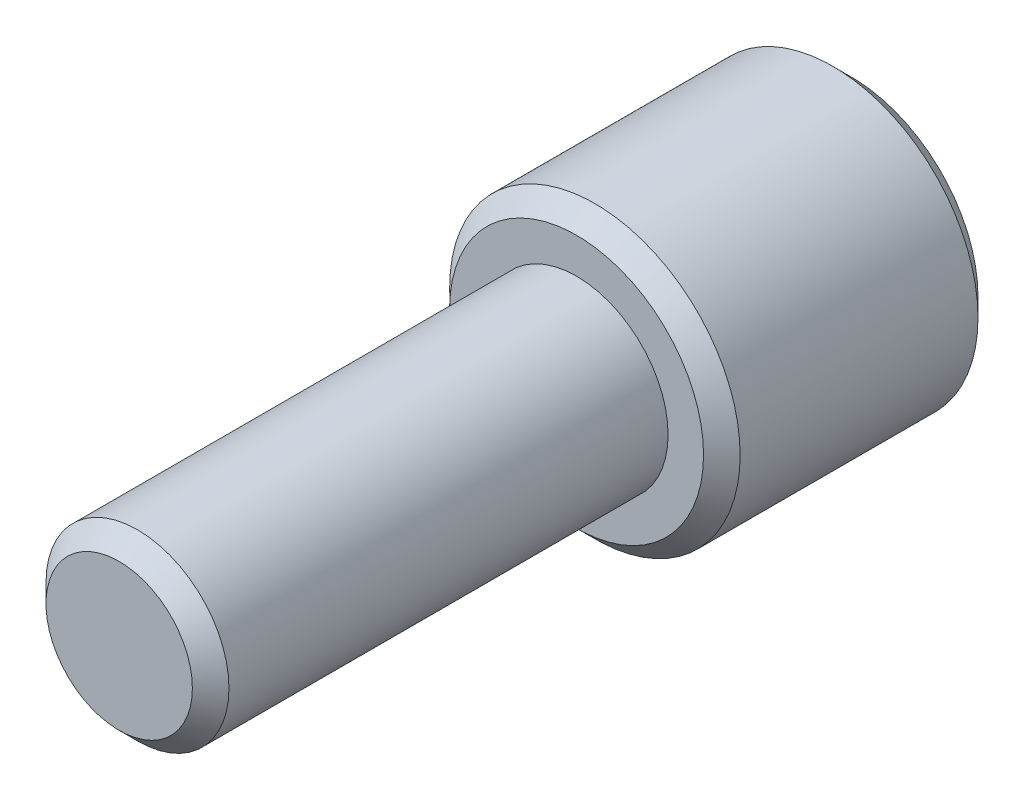
ISO-10303-21;
HEADER;
FILE_DESCRIPTION(('STEP AP214'),'2;1');
FILE_NAME('part.step','',(''),(''),'','','');
FILE_SCHEMA(('AUTOMOTIVE_DESIGN { 1 0 10303 214 1 1 1 1 }'));
ENDSEC;
DATA;
#1=APPLICATION_CONTEXT('core data for automotive mechanical design processes');
#2=APPLICATION_PROTOCOL_DEFINITION('international standard','automotive_design',2000,#1);
#3=PRODUCT_CONTEXT('',#1,'mechanical');
#4=PRODUCT('Part','Part','',(#3));
#5=PRODUCT_RELATED_PRODUCT_CATEGORY('part','',(#4));
#6=PRODUCT_DEFINITION_FORMATION('','',#4);
#7=PRODUCT_DEFINITION_CONTEXT('part definition',#1,'design');
#8=PRODUCT_DEFINITION('design','',#6,#7);
#9=PRODUCT_DEFINITION_SHAPE('','',#8);
#10=(LENGTH_UNIT() NAMED_UNIT(*) SI_UNIT(.MILLI.,.METRE.));
#11=(NAMED_UNIT(*) PLANE_ANGLE_UNIT() SI_UNIT($,.RADIAN.));
#12=(NAMED_UNIT(*) SI_UNIT($,.STERADIAN.) SOLID_ANGLE_UNIT());
#13=UNCERTAINTY_MEASURE_WITH_UNIT(LENGTH_MEASURE(1.E-05),#10,'distance_accuracy_value','');
#14=(GEOMETRIC_REPRESENTATION_CONTEXT(3) GLOBAL_UNCERTAINTY_ASSIGNED_CONTEXT((#13)) GLOBAL_UNIT_ASSIGNED_CONTEXT((#10,
#11,#12)) REPRESENTATION_CONTEXT('',''));
#15=CARTESIAN_POINT('',(0.,0.,0.));
#16=DIRECTION('',(0.,0.,1.));
#17=DIRECTION('',(1.,0.,0.));
#18=AXIS2_PLACEMENT_3D('',#15,#16,#17);
#19=CARTESIAN_POINT('',(0.,0.,12.));
#20=DIRECTION('',(0.,0.,1.));
#21=DIRECTION('',(1.,0.,0.));
#22=AXIS2_PLACEMENT_3D('',#19,#20,#21);
#23=PLANE('',#22);
#24=CARTESIAN_POINT('',(0.,0.,12.));
#25=DIRECTION('',(0.,0.,1.));
#26=DIRECTION('',(1.,0.,0.));
#27=AXIS2_PLACEMENT_3D('',#24,#25,#26);
#28=CIRCLE('',#27,5.54999999999999);
#29=CARTESIAN_POINT('',(5.54999999999999,0.,12.));
#30=VERTEX_POINT('',#29);
#31=EDGE_CURVE('E140',#30,#30,#28,.T.);
#32=ORIENTED_EDGE('',*,*,#31,.T.);
#33=EDGE_LOOP('',(#32));
#34=FACE_BOUND('',#33,.T.);
#35=CARTESIAN_POINT('',(0.,0.,12.));
#36=DIRECTION('',(0.,0.,1.));
#37=DIRECTION('',(1.,0.,0.));
#38=AXIS2_PLACEMENT_3D('',#35,#36,#37);
#39=CIRCLE('',#38,4.);
#40=CARTESIAN_POINT('',(4.,0.,12.));
#41=VERTEX_POINT('',#40);
#42=EDGE_CURVE('E56',#41,#41,#39,.T.);
#43=ORIENTED_EDGE('',*,*,#42,.F.);
#44=EDGE_LOOP('',(#43));
#45=FACE_BOUND('',#44,.T.);
#46=ADVANCED_FACE('F33',(#34,#45),#23,.T.);
#47=CARTESIAN_POINT('',(0.,0.,12.));
#48=DIRECTION('',(0.,0.,-1.));
#49=DIRECTION('',(-1.,0.,0.));
#50=AXIS2_PLACEMENT_3D('',#47,#48,#49);
#51=CYLINDRICAL_SURFACE('',#50,6.35);
#52=CARTESIAN_POINT('',(0.,0.,11.2));
#53=DIRECTION('',(0.,0.,1.));
#54=DIRECTION('',(1.,0.,0.));
#55=AXIS2_PLACEMENT_3D('',#52,#53,#54);
#56=CIRCLE('',#55,6.35);
#57=CARTESIAN_POINT('',(6.35,0.,11.2));
#58=VERTEX_POINT('',#57);
#59=EDGE_CURVE('E41',#58,#58,#56,.F.);
#60=ORIENTED_EDGE('',*,*,#59,.T.);
#61=EDGE_LOOP('',(#60));
#62=FACE_BOUND('',#61,.T.);
#63=CARTESIAN_POINT('',(0.,0.,0.800000000000002));
#64=DIRECTION('',(0.,0.,1.));
#65=DIRECTION('',(1.,0.,0.));
#66=AXIS2_PLACEMENT_3D('',#63,#64,#65);
#67=CIRCLE('',#66,6.35);
#68=CARTESIAN_POINT('',(6.35,0.,0.800000000000002));
#69=VERTEX_POINT('',#68);
#70=EDGE_CURVE('E144',#69,#69,#67,.T.);
#71=ORIENTED_EDGE('',*,*,#70,.T.);
#72=EDGE_LOOP('',(#71));
#73=FACE_BOUND('',#72,.T.);
#74=CARTESIAN_POINT('',(0.,-6.35,8.));
#75=CARTESIAN_POINT('',(0.109459382542907,-6.34999954177388,7.99999941645051));
#76=CARTESIAN_POINT('',(0.218925049959982,-6.34714311321166,7.99098441289842));
#77=CARTESIAN_POINT('',(0.434652473788955,-6.33602827356407,7.9552589175087));
#78=CARTESIAN_POINT('',(0.540913545874182,-6.32776871709148,7.92854467366542));
#79=CARTESIAN_POINT('',(0.747089875657803,-6.30674936557198,7.85841283927101));
#80=CARTESIAN_POINT('',(0.847014764673543,-6.2939966038065,7.8150213442808));
#81=CARTESIAN_POINT('',(1.03817017833074,-6.26530583445687,7.712878559723));
#82=CARTESIAN_POINT('',(1.12939928812193,-6.24936730983397,7.65412477642937));
#83=CARTESIAN_POINT('',(1.30343118018697,-6.21543683798116,7.52098863879435));
#84=CARTESIAN_POINT('',(1.38592345094522,-6.19739963027479,7.44621197364388));
#85=CARTESIAN_POINT('',(1.53742831833673,-6.16156531174633,7.28399212756702));
#86=CARTESIAN_POINT('',(1.60643835501439,-6.14376824711775,7.19654654659375));
#87=CARTESIAN_POINT('',(1.73071363408787,-6.10994220236164,7.00877070623833));
#88=CARTESIAN_POINT('',(1.78558916761594,-6.09396900491067,6.90817152277175));
#89=CARTESIAN_POINT('',(1.87751386092633,-6.06628083683232,6.69858801339595));
#90=CARTESIAN_POINT('',(1.91456780104787,-6.05456472452069,6.58960594516073));
#91=CARTESIAN_POINT('',(1.96865797245166,-6.03719105635797,6.36985743245523));
#92=CARTESIAN_POINT('',(1.98627089440143,-6.03135942687504,6.25924708658491));
#93=CARTESIAN_POINT('',(2.00278087222624,-6.02589838737814,6.03649943839799));
#94=CARTESIAN_POINT('',(2.00168299423813,-6.02626729850521,5.9243625576223));
#95=CARTESIAN_POINT('',(1.98125320609646,-6.03301213155008,5.70653203745703));
#96=CARTESIAN_POINT('',(1.96265658538293,-6.03914580837347,5.60076066873881));
#97=CARTESIAN_POINT('',(1.90895021373769,-6.05633519979143,5.39392306571445));
#98=CARTESIAN_POINT('',(1.8738386824976,-6.06739144503234,5.2928573399681));
#99=CARTESIAN_POINT('',(1.78758434079555,-6.0933643515369,5.09655766918764));
#100=CARTESIAN_POINT('',(1.73621215869284,-6.10833567795451,5.00143205398725));
#101=CARTESIAN_POINT('',(1.6190540664784,-6.14042705773518,4.82091127849859));
#102=CARTESIAN_POINT('',(1.55326436261562,-6.15754767614423,4.73551868831451));
#103=CARTESIAN_POINT('',(1.40553948054554,-6.19297824394465,4.57273387677394));
#104=CARTESIAN_POINT('',(1.32299795804768,-6.2113065642987,4.4958948770763));
#105=CARTESIAN_POINT('',(1.14597287727256,-6.24638917019528,4.35701392399215));
#106=CARTESIAN_POINT('',(1.05148840693985,-6.26314333535266,4.29497310175418));
#107=CARTESIAN_POINT('',(0.852181054275978,-6.29337063173253,4.18706679062044));
#108=CARTESIAN_POINT('',(0.747281283701516,-6.30681635072294,4.14133511854089));
#109=CARTESIAN_POINT('',(0.53075539857108,-6.32871380255594,4.06833214610388));
#110=CARTESIAN_POINT('',(0.419131371671138,-6.33716707666898,4.0410551480299));
#111=CARTESIAN_POINT('',(0.197020017835357,-6.34787832908592,4.00668253217873));
#112=CARTESIAN_POINT('',(0.0866594761204072,-6.35036604099747,3.9988381508384));
#113=CARTESIAN_POINT('',(-0.133813926362037,-6.34954641773507,4.00143980144652));
#114=CARTESIAN_POINT('',(-0.243926821510502,-6.34623994398884,4.01188311454394));
#115=CARTESIAN_POINT('',(-0.45787863778879,-6.33435451969435,4.05016353853882));
#116=CARTESIAN_POINT('',(-0.561805824109793,-6.325911202165,4.07755349672888));
#117=CARTESIAN_POINT('',(-0.763559126456237,-6.30474229444981,4.14840255163337));
#118=CARTESIAN_POINT('',(-0.86138448373332,-6.29201617296049,4.19186364211909));
#119=CARTESIAN_POINT('',(-1.05083641206033,-6.26319856305455,4.29481624770412));
#120=CARTESIAN_POINT('',(-1.14225110153446,-6.24703194034033,4.35467605180154));
#121=CARTESIAN_POINT('',(-1.31398832981217,-6.21318025142311,4.48828611830548));
#122=CARTESIAN_POINT('',(-1.394307804701,-6.19549476796846,4.56204020434403));
#123=CARTESIAN_POINT('',(-1.54493496266177,-6.15970098041184,4.72486730316873));
#124=CARTESIAN_POINT('',(-1.61470885314466,-6.1416043516294,4.81443781225088));
#125=CARTESIAN_POINT('',(-1.73828550034023,-6.10778048462924,5.00440908318169));
#126=CARTESIAN_POINT('',(-1.79208847266323,-6.09205321442616,5.10480969879696));
#127=CARTESIAN_POINT('',(-1.88186972548412,-6.06492137157673,5.31340922433402));
#128=CARTESIAN_POINT('',(-1.91791378151849,-6.05350088491069,5.42157763111646));
#129=CARTESIAN_POINT('',(-1.97114343438127,-6.03638058511952,5.64288296304508));
#130=CARTESIAN_POINT('',(-1.98833635449891,-6.03067855056365,5.75601794100063));
#131=CARTESIAN_POINT('',(-2.00284439370545,-6.02587471885277,5.97845754983298));
#132=CARTESIAN_POINT('',(-2.00103634345504,-6.02648176413455,6.08769940250111));
#133=CARTESIAN_POINT('',(-1.97971522185172,-6.03351893966243,6.30424061257888));
#134=CARTESIAN_POINT('',(-1.96020300106662,-6.03994879016139,6.41154006305545));
#135=CARTESIAN_POINT('',(-1.90461841343822,-6.05770205715241,6.61955543972629));
#136=CARTESIAN_POINT('',(-1.86880073990097,-6.06895005951139,6.72034634805821));
#137=CARTESIAN_POINT('',(-1.78182311987174,-6.0950519726527,6.91456815637816));
#138=CARTESIAN_POINT('',(-1.7306600173762,-6.10990662507357,7.00799753736861));
#139=CARTESIAN_POINT('',(-1.61207166769779,-6.14228296482453,7.18885533551896));
#140=CARTESIAN_POINT('',(-1.54408200610561,-6.15988705347009,7.275898871557));
#141=CARTESIAN_POINT('',(-1.39475914789555,-6.19540382399595,7.43762516074985));
#142=CARTESIAN_POINT('',(-1.31342235965995,-6.21331658777418,7.51230457591052));
#143=CARTESIAN_POINT('',(-1.13645022907771,-6.24814930497826,7.64967858918255));
#144=CARTESIAN_POINT('',(-1.04042842012035,-6.26501620684602,7.71189029117953));
#145=CARTESIAN_POINT('',(-0.838759092324702,-6.29518499838427,7.8192078809382));
#146=CARTESIAN_POINT('',(-0.733115228456041,-6.30848823421976,7.86432023061282));
#147=CARTESIAN_POINT('',(-0.523924084589957,-6.32915110555605,7.93303881102666));
#148=CARTESIAN_POINT('',(-0.420884380962412,-6.33690087757196,7.95807602276617));
#149=CARTESIAN_POINT('',(-0.211898004201454,-6.34732501355995,7.99155515687942));
#150=CARTESIAN_POINT('',(-0.105951946376475,-6.35000044354306,8.00000056485066));
#151=CARTESIAN_POINT('',(0.,-6.35,8.));
#152=B_SPLINE_CURVE_WITH_KNOTS('',3,(#74,#75,#76,#77,#78,#79,#80,#81,#82,#83,#84,#85,#86,#87,
#88,#89,#90,#91,#92,#93,#94,#95,#96,#97,#98,#99,#100,#101,#102,#103,#104,#105,#106,#107,#108,
#109,#110,#111,#112,#113,#114,#115,#116,#117,#118,#119,#120,#121,#122,#123,#124,#125,#126,#127,
#128,#129,#130,#131,#132,#133,#134,#135,#136,#137,#138,#139,#140,#141,#142,#143,#144,#145,#146,
#147,#148,#149,#150,#151),.UNSPECIFIED.,.T.,.F.,(4,2,2,2,2,2,2,2,2,2,2,2,2,2,2,2,2,2,2,2,2,2,2,
2,2,2,2,2,2,2,2,2,2,2,2,2,2,2,4),(0.,0.327988650558007,0.656046852642941,0.983593805173075,
1.31119396071542,1.6480406473964,1.98495123122211,2.33034249119075,2.67564105409013,
3.01039595432063,3.34506021774285,3.66626171481525,3.98749784536771,4.31348397544876,
4.63955598702786,4.98071999436009,5.3219100713613,5.66583848283943,6.00966066096294,
6.34001323425943,6.67031669785622,6.99225602053112,7.31423529613717,7.64414085870835,
7.97413734250023,8.31743010871831,8.66071824020989,9.00272515843012,9.34459916667783,
9.6707687934964,9.99692275086076,10.3181482438305,10.6394398466999,10.9734721104888,
11.3075944078494,11.6528624869261,11.9979999574323,12.3155454971876,12.6330243200048),.UNSPECIFIED.);
#153=CARTESIAN_POINT('',(0.,-6.35,8.));
#154=VERTEX_POINT('',#153);
#155=EDGE_CURVE('E62',#154,#154,#152,.T.);
#156=ORIENTED_EDGE('',*,*,#155,.T.);
#157=EDGE_LOOP('',(#156));
#158=FACE_BOUND('',#157,.T.);
#159=CARTESIAN_POINT('',(-6.35,0.,4.));
#160=CARTESIAN_POINT('',(-6.34999954177388,0.109459382542907,4.00000058354949));
#161=CARTESIAN_POINT('',(-6.34714311321166,0.218925049959982,4.00901558710158));
#162=CARTESIAN_POINT('',(-6.33602827356407,0.434652473788955,4.0447410824913));
#163=CARTESIAN_POINT('',(-6.32776871709148,0.540913545874182,4.07145532633459));
#164=CARTESIAN_POINT('',(-6.30674936557198,0.747089875657803,4.14158716072899));
#165=CARTESIAN_POINT('',(-6.2939966038065,0.847014764673544,4.1849786557192));
#166=CARTESIAN_POINT('',(-6.26530583445687,1.03817017833074,4.287121440277));
#167=CARTESIAN_POINT('',(-6.24936730983396,1.12939928812193,4.34587522357063));
#168=CARTESIAN_POINT('',(-6.21543683798116,1.30343118018697,4.47901136120565));
#169=CARTESIAN_POINT('',(-6.19739963027479,1.38592345094522,4.55378802635612));
#170=CARTESIAN_POINT('',(-6.16156531174633,1.53742831833673,4.71600787243298));
#171=CARTESIAN_POINT('',(-6.14376824711775,1.60643835501439,4.80345345340625));
#172=CARTESIAN_POINT('',(-6.10994220236164,1.73071363408787,4.99122929376167));
#173=CARTESIAN_POINT('',(-6.09396900491067,1.78558916761594,5.09182847722825));
#174=CARTESIAN_POINT('',(-6.06628083683232,1.87751386092633,5.30141198660405));
#175=CARTESIAN_POINT('',(-6.05456472452069,1.91456780104787,5.41039405483927));
#176=CARTESIAN_POINT('',(-6.03719105635797,1.96865797245166,5.63014256754477));
#177=CARTESIAN_POINT('',(-6.03135942687504,1.98627089440143,5.74075291341509));
#178=CARTESIAN_POINT('',(-6.02589838737814,2.00278087222624,5.96350056160201));
#179=CARTESIAN_POINT('',(-6.02626729850521,2.00168299423813,6.0756374423777));
#180=CARTESIAN_POINT('',(-6.03301213155008,1.98125320609646,6.29346796254297));
#181=CARTESIAN_POINT('',(-6.03914580837347,1.96265658538293,6.39923933126119));
#182=CARTESIAN_POINT('',(-6.05633519979143,1.90895021373769,6.60607693428555));
#183=CARTESIAN_POINT('',(-6.06739144503234,1.8738386824976,6.7071426600319));
#184=CARTESIAN_POINT('',(-6.0933643515369,1.78758434079555,6.90344233081236));
#185=CARTESIAN_POINT('',(-6.10833567795451,1.73621215869284,6.99856794601275));
#186=CARTESIAN_POINT('',(-6.14042705773518,1.6190540664784,7.17908872150141));
#187=CARTESIAN_POINT('',(-6.15754767614423,1.55326436261562,7.26448131168549));
#188=CARTESIAN_POINT('',(-6.19297824394465,1.40553948054554,7.42726612322606));
#189=CARTESIAN_POINT('',(-6.2113065642987,1.32299795804768,7.5041051229237));
#190=CARTESIAN_POINT('',(-6.24638917019528,1.14597287727256,7.64298607600785));
#191=CARTESIAN_POINT('',(-6.26314333535266,1.05148840693984,7.70502689824583));
#192=CARTESIAN_POINT('',(-6.29337063173254,0.852181054275976,7.81293320937956));
#193=CARTESIAN_POINT('',(-6.30681635072295,0.747281283701515,7.85866488145912));
#194=CARTESIAN_POINT('',(-6.32871380255594,0.530755398571079,7.93166785389612));
#195=CARTESIAN_POINT('',(-6.33716707666898,0.419131371671138,7.9589448519701));
#196=CARTESIAN_POINT('',(-6.34787832908592,0.197020017835356,7.99331746782127));
#197=CARTESIAN_POINT('',(-6.35036604099747,0.0866594761204061,8.0011618491616));
#198=CARTESIAN_POINT('',(-6.34954641773507,-0.133813926362039,7.99856019855348));
#199=CARTESIAN_POINT('',(-6.34623994398884,-0.243926821510504,7.98811688545606));
#200=CARTESIAN_POINT('',(-6.33435451969435,-0.457878637788792,7.94983646146118));
#201=CARTESIAN_POINT('',(-6.325911202165,-0.561805824109796,7.92244650327112));
#202=CARTESIAN_POINT('',(-6.30474229444981,-0.76355912645624,7.85159744836663));
#203=CARTESIAN_POINT('',(-6.29201617296049,-0.861384483733322,7.8081363578809));
#204=CARTESIAN_POINT('',(-6.26319856305455,-1.05083641206033,7.70518375229588));
#205=CARTESIAN_POINT('',(-6.24703194034033,-1.14225110153446,7.64532394819846));
#206=CARTESIAN_POINT('',(-6.21318025142311,-1.31398832981217,7.51171388169452));
#207=CARTESIAN_POINT('',(-6.19549476796846,-1.394307804701,7.43795979565597));
#208=CARTESIAN_POINT('',(-6.15970098041184,-1.54493496266177,7.27513269683127));
#209=CARTESIAN_POINT('',(-6.1416043516294,-1.61470885314467,7.18556218774911));
#210=CARTESIAN_POINT('',(-6.10778048462924,-1.73828550034023,6.99559091681831));
#211=CARTESIAN_POINT('',(-6.09205321442616,-1.79208847266324,6.89519030120304));
#212=CARTESIAN_POINT('',(-6.06492137157673,-1.88186972548412,6.68659077566598));
#213=CARTESIAN_POINT('',(-6.05350088491069,-1.91791378151849,6.57842236888353));
#214=CARTESIAN_POINT('',(-6.03638058511951,-1.97114343438128,6.35711703695491));
#215=CARTESIAN_POINT('',(-6.03067855056365,-1.98833635449891,6.24398205899937));
#216=CARTESIAN_POINT('',(-6.02587471885277,-2.00284439370545,6.02154245016702));
#217=CARTESIAN_POINT('',(-6.02648176413455,-2.00103634345504,5.91230059749889));
#218=CARTESIAN_POINT('',(-6.03351893966243,-1.97971522185172,5.69575938742112));
#219=CARTESIAN_POINT('',(-6.03994879016139,-1.96020300106662,5.58845993694455));
#220=CARTESIAN_POINT('',(-6.05770205715241,-1.90461841343822,5.3804445602737));
#221=CARTESIAN_POINT('',(-6.06895005951139,-1.86880073990097,5.27965365194179));
#222=CARTESIAN_POINT('',(-6.0950519726527,-1.78182311987174,5.08543184362183));
#223=CARTESIAN_POINT('',(-6.10990662507357,-1.7306600173762,4.99200246263139));
#224=CARTESIAN_POINT('',(-6.14228296482453,-1.61207166769779,4.81114466448104));
#225=CARTESIAN_POINT('',(-6.15988705347009,-1.54408200610561,4.724101128443));
#226=CARTESIAN_POINT('',(-6.19540382399595,-1.39475914789555,4.56237483925015));
#227=CARTESIAN_POINT('',(-6.21331658777418,-1.31342235965995,4.48769542408948));
#228=CARTESIAN_POINT('',(-6.24814930497826,-1.1364502290777,4.35032141081745));
#229=CARTESIAN_POINT('',(-6.26501620684602,-1.04042842012034,4.28810970882047));
#230=CARTESIAN_POINT('',(-6.29518499838427,-0.838759092324699,4.1807921190618));
#231=CARTESIAN_POINT('',(-6.30848823421976,-0.733115228456038,4.13567976938717));
#232=CARTESIAN_POINT('',(-6.32915110555605,-0.523924084589954,4.06696118897334));
#233=CARTESIAN_POINT('',(-6.33690087757196,-0.42088438096241,4.04192397723383));
#234=CARTESIAN_POINT('',(-6.34732501355995,-0.211898004201453,4.00844484312058));
#235=CARTESIAN_POINT('',(-6.35000044354306,-0.105951946376475,3.99999943514934));
#236=CARTESIAN_POINT('',(-6.35,0.,4.));
#237=B_SPLINE_CURVE_WITH_KNOTS('',3,(#159,#160,#161,#162,#163,#164,#165,#166,#167,#168,#169,
#170,#171,#172,#173,#174,#175,#176,#177,#178,#179,#180,#181,#182,#183,#184,#185,#186,#187,#188,
#189,#190,#191,#192,#193,#194,#195,#196,#197,#198,#199,#200,#201,#202,#203,#204,#205,#206,#207,
#208,#209,#210,#211,#212,#213,#214,#215,#216,#217,#218,#219,#220,#221,#222,#223,#224,#225,#226,
#227,#228,#229,#230,#231,#232,#233,#234,#235,#236),.UNSPECIFIED.,.T.,.F.,(4,2,2,2,2,2,2,2,2,2,2,
2,2,2,2,2,2,2,2,2,2,2,2,2,2,2,2,2,2,2,2,2,2,2,2,2,2,2,4),(0.,0.327988650558007,
0.656046852642941,0.983593805173076,1.31119396071542,1.6480406473964,1.98495123122211,
2.33034249119075,2.67564105409013,3.01039595432063,3.34506021774285,3.66626171481526,
3.98749784536771,4.31348397544876,4.63955598702786,4.9807199943601,5.32191007136131,
5.66583848283943,6.00966066096294,6.34001323425943,6.67031669785623,6.99225602053112,
7.31423529613717,7.64414085870835,7.97413734250024,8.31743010871831,8.6607182402099,
9.00272515843012,9.34459916667784,9.67076879349641,9.99692275086076,10.3181482438305,
10.6394398466999,10.9734721104888,11.3075944078494,11.6528624869261,11.9979999574323,
12.3155454971876,12.6330243200048),.UNSPECIFIED.);
#238=CARTESIAN_POINT('',(-6.35,0.,4.));
#239=VERTEX_POINT('',#238);
#240=EDGE_CURVE('E66',#239,#239,#237,.T.);
#241=ORIENTED_EDGE('',*,*,#240,.T.);
#242=EDGE_LOOP('',(#241));
#243=FACE_BOUND('',#242,.T.);
#244=ADVANCED_FACE('F96',(#62,#73,#158,#243),#51,.T.);
#245=CARTESIAN_POINT('',(0.,0.,0.));
#246=DIRECTION('',(0.,0.,1.));
#247=DIRECTION('',(1.,0.,0.));
#248=AXIS2_PLACEMENT_3D('',#245,#246,#247);
#249=PLANE('',#248);
#250=CARTESIAN_POINT('',(0.,0.,0.));
#251=DIRECTION('',(0.,0.,1.));
#252=DIRECTION('',(1.,0.,0.));
#253=AXIS2_PLACEMENT_3D('',#250,#251,#252);
#254=CIRCLE('',#253,5.55);
#255=CARTESIAN_POINT('',(5.55,0.,0.));
#256=VERTEX_POINT('',#255);
#257=EDGE_CURVE('E11',#256,#256,#254,.F.);
#258=ORIENTED_EDGE('',*,*,#257,.T.);
#259=EDGE_LOOP('',(#258));
#260=FACE_BOUND('',#259,.T.);
#261=CARTESIAN_POINT('',(0.,0.,0.));
#262=DIRECTION('',(0.,0.,-1.));
#263=DIRECTION('',(-1.,0.,0.));
#264=AXIS2_PLACEMENT_3D('',#261,#262,#263);
#265=CIRCLE('',#264,2.5);
#266=CARTESIAN_POINT('',(-2.5,0.,0.));
#267=VERTEX_POINT('',#266);
#268=EDGE_CURVE('E69',#267,#267,#265,.T.);
#269=ORIENTED_EDGE('',*,*,#268,.F.);
#270=EDGE_LOOP('',(#269));
#271=FACE_BOUND('',#270,.T.);
#272=ADVANCED_FACE('F101',(#260,#271),#249,.F.);
#273=CARTESIAN_POINT('',(0.,0.,32.));
#274=DIRECTION('',(0.,0.,-1.));
#275=DIRECTION('',(-1.,0.,0.));
#276=AXIS2_PLACEMENT_3D('',#273,#274,#275);
#277=CYLINDRICAL_SURFACE('',#276,4.);
#278=CARTESIAN_POINT('',(0.,0.,31.2));
#279=DIRECTION('',(0.,0.,1.));
#280=DIRECTION('',(1.,0.,0.));
#281=AXIS2_PLACEMENT_3D('',#278,#279,#280);
#282=CIRCLE('',#281,4.);
#283=CARTESIAN_POINT('',(4.,0.,31.2));
#284=VERTEX_POINT('',#283);
#285=EDGE_CURVE('E138',#284,#284,#282,.F.);
#286=ORIENTED_EDGE('',*,*,#285,.T.);
#287=EDGE_LOOP('',(#286));
#288=FACE_BOUND('',#287,.T.);
#289=ORIENTED_EDGE('',*,*,#42,.T.);
#290=EDGE_LOOP('',(#289));
#291=FACE_BOUND('',#290,.T.);
#292=ADVANCED_FACE('F125',(#288,#291),#277,.T.);
#293=CARTESIAN_POINT('',(0.,0.,32.));
#294=DIRECTION('',(0.,0.,1.));
#295=DIRECTION('',(1.,0.,0.));
#296=AXIS2_PLACEMENT_3D('',#293,#294,#295);
#297=PLANE('',#296);
#298=CARTESIAN_POINT('',(0.,0.,32.));
#299=DIRECTION('',(0.,0.,1.));
#300=DIRECTION('',(1.,0.,0.));
#301=AXIS2_PLACEMENT_3D('',#298,#299,#300);
#302=CIRCLE('',#301,3.2);
#303=CARTESIAN_POINT('',(3.2,0.,32.));
#304=VERTEX_POINT('',#303);
#305=EDGE_CURVE('E55',#304,#304,#302,.T.);
#306=ORIENTED_EDGE('',*,*,#305,.T.);
#307=EDGE_LOOP('',(#306));
#308=FACE_BOUND('',#307,.T.);
#309=ADVANCED_FACE('F127',(#308),#297,.T.);
#310=CARTESIAN_POINT('',(0.,0.,10.));
#311=DIRECTION('',(0.,0.,-1.));
#312=DIRECTION('',(-1.,0.,0.));
#313=AXIS2_PLACEMENT_3D('',#310,#311,#312);
#314=CYLINDRICAL_SURFACE('',#313,2.5);
#315=CARTESIAN_POINT('',(-2.5,0.,8.));
#316=CARTESIAN_POINT('',(-2.49999264947401,0.0959968964388692,7.99999242056707));
#317=CARTESIAN_POINT('',(-2.49441368411908,0.192133192964674,7.99303057133644));
#318=CARTESIAN_POINT('',(-2.47259269360604,0.381319365477407,7.96565005995827));
#319=CARTESIAN_POINT('',(-2.45632708000382,0.474361934321336,7.94520162873807));
#320=CARTESIAN_POINT('',(-2.4146672181517,0.654094916824507,7.89232172110493));
#321=CARTESIAN_POINT('',(-2.38933120144167,0.740821698128048,7.85996664856862));
#322=CARTESIAN_POINT('',(-2.33136010996601,0.906926323692543,7.78488265652265));
#323=CARTESIAN_POINT('',(-2.29872501207752,0.986304144671504,7.74215370414941));
#324=CARTESIAN_POINT('',(-2.21575664728952,1.16318123656703,7.63137163496894));
#325=CARTESIAN_POINT('',(-2.16321748603216,1.25736767952115,7.55968108482594));
#326=CARTESIAN_POINT('',(-2.05292192603027,1.43041367827883,7.4027219342605));
#327=CARTESIAN_POINT('',(-1.99515072200505,1.50922761533153,7.31741424649663));
#328=CARTESIAN_POINT('',(-1.87856001629835,1.6521591895554,7.13322601592733));
#329=CARTESIAN_POINT('',(-1.81973830902028,1.71602638457222,7.03415322702388));
#330=CARTESIAN_POINT('',(-1.7088210988299,1.82646834413604,6.82346121749581));
#331=CARTESIAN_POINT('',(-1.65670347089169,1.87310099386401,6.71188566611201));
#332=CARTESIAN_POINT('',(-1.58835652300928,1.93086043771819,6.52612104832302));
#333=CARTESIAN_POINT('',(-1.56628727770188,1.94865475820658,6.45618826201971));
#334=CARTESIAN_POINT('',(-1.53069889155832,1.97673396798331,6.31278731587953));
#335=CARTESIAN_POINT('',(-1.5171587417974,1.98703731881776,6.239328326475));
#336=CARTESIAN_POINT('',(-1.50084234061103,1.99939840142554,6.08980748112896));
#337=CARTESIAN_POINT('',(-1.49816096926556,2.00138345613423,6.01372851517921));
#338=CARTESIAN_POINT('',(-1.50439962302809,1.99669481699685,5.86229510796726));
#339=CARTESIAN_POINT('',(-1.51332946660241,1.99001379511087,5.7869413342337));
#340=CARTESIAN_POINT('',(-1.5432072129997,1.9669530271194,5.62777769738727));
#341=CARTESIAN_POINT('',(-1.56581842049528,1.94921808205621,5.544491993946));
#342=CARTESIAN_POINT('',(-1.61997459936279,1.90444547348848,5.38346444046297));
#343=CARTESIAN_POINT('',(-1.65154598198641,1.87738025642251,5.30573984346018));
#344=CARTESIAN_POINT('',(-1.73656116159416,1.79974102194077,5.11933789395902));
#345=CARTESIAN_POINT('',(-1.79313372968153,1.74414886595504,5.01419730169581));
#346=CARTESIAN_POINT('',(-1.90913780060687,1.61638467497537,4.81628332220067));
#347=CARTESIAN_POINT('',(-1.96857337048937,1.54418846902465,4.72352827915646));
#348=CARTESIAN_POINT('',(-2.08612751968448,1.38145818326396,4.54872522859493));
#349=CARTESIAN_POINT('',(-2.14416889260779,1.29048701026967,4.46702807769423));
#350=CARTESIAN_POINT('',(-2.25171871494994,1.09198491072667,4.31990050056569));
#351=CARTESIAN_POINT('',(-2.3012499182245,0.98449964520108,4.25442648388277));
#352=CARTESIAN_POINT('',(-2.37424585643318,0.78777781438056,4.1594371525901));
#353=CARTESIAN_POINT('',(-2.40111071224171,0.702177727329207,4.12499549556093));
#354=CARTESIAN_POINT('',(-2.44597564111417,0.524913923737154,4.06787354901203));
#355=CARTESIAN_POINT('',(-2.46398239496913,0.433254836272285,4.04518439505452));
#356=CARTESIAN_POINT('',(-2.48970335685206,0.245713233844928,4.01286145306421));
#357=CARTESIAN_POINT('',(-2.49736378633666,0.149811307212617,4.00329587525504));
#358=CARTESIAN_POINT('',(-2.50148682701864,-0.0426080028675175,3.99814095102371));
#359=CARTESIAN_POINT('',(-2.49795152409062,-0.139125268327962,4.00254900117794));
#360=CARTESIAN_POINT('',(-2.48076858642945,-0.321746674155462,4.02408281624768));
#361=CARTESIAN_POINT('',(-2.46796352405063,-0.408060891756566,4.04014917513901));
#362=CARTESIAN_POINT('',(-2.43417513213473,-0.576335674228721,4.08287218110156));
#363=CARTESIAN_POINT('',(-2.41318937553438,-0.65829493885694,4.10953197109662));
#364=CARTESIAN_POINT('',(-2.36289849431328,-0.821235877548909,4.17415037178393));
#365=CARTESIAN_POINT('',(-2.33315912736867,-0.901843619419054,4.21270578595636));
#366=CARTESIAN_POINT('',(-2.26783622722139,-1.05541000448331,4.29886215163279));
#367=CARTESIAN_POINT('',(-2.23225240258423,-1.12836826593788,4.34646355423455));
#368=CARTESIAN_POINT('',(-2.14993687522397,-1.27925237569143,4.45922431829687));
#369=CARTESIAN_POINT('',(-2.1023696976822,-1.35550718978129,4.526001690483));
#370=CARTESIAN_POINT('',(-2.00443497952019,-1.4965368759753,4.66938696137098));
#371=CARTESIAN_POINT('',(-1.95405970991097,-1.56127777727367,4.74602283683883));
#372=CARTESIAN_POINT('',(-1.87374135317135,-1.65568487930787,4.87643444323659));
#373=CARTESIAN_POINT('',(-1.84354743685463,-1.68913741792652,4.92736059075333));
#374=CARTESIAN_POINT('',(-1.78435415521131,-1.75155001920543,5.03262226142359));
#375=CARTESIAN_POINT('',(-1.75535542951891,-1.78050769868976,5.08695957188079));
#376=CARTESIAN_POINT('',(-1.69983828792997,-1.83358089959817,5.19887484028166));
#377=CARTESIAN_POINT('',(-1.67331090774834,-1.85771431687654,5.25643976724369));
#378=CARTESIAN_POINT('',(-1.62410209867689,-1.90088481958635,5.37500897850398));
#379=CARTESIAN_POINT('',(-1.60141789380427,-1.9199255893155,5.43601073751954));
#380=CARTESIAN_POINT('',(-1.5601942022258,-1.95360165889083,5.5660867242378));
#381=CARTESIAN_POINT('',(-1.54209716714775,-1.96779559724999,5.63542266494035));
#382=CARTESIAN_POINT('',(-1.5149337159379,-1.98878905619367,5.77683761273805));
#383=CARTESIAN_POINT('',(-1.50584452307524,-1.99560723074758,5.84890922045048));
#384=CARTESIAN_POINT('',(-1.49824736779721,-2.00132058716546,5.99434870546408));
#385=CARTESIAN_POINT('',(-1.49979625918437,-2.0001731977979,6.06772145415416));
#386=CARTESIAN_POINT('',(-1.51330771695992,-1.98996519544204,6.2129841930231));
#387=CARTESIAN_POINT('',(-1.52528679347386,-1.98089203653787,6.2848716473261));
#388=CARTESIAN_POINT('',(-1.56207076756083,-1.95207745752715,6.44460677434455));
#389=CARTESIAN_POINT('',(-1.5894925841937,-1.93009230408643,6.53142308249112));
#390=CARTESIAN_POINT('',(-1.65288907642407,-1.87608177217432,6.69863347868964));
#391=CARTESIAN_POINT('',(-1.68888887211293,-1.84402681542564,6.77900776003671));
#392=CARTESIAN_POINT('',(-1.75491158724438,-1.78094746311468,6.91217772204615));
#393=CARTESIAN_POINT('',(-1.78388907325007,-1.7520236319041,6.96651918151829));
#394=CARTESIAN_POINT('',(-1.84307948739002,-1.68964733782463,7.07183822981726));
#395=CARTESIAN_POINT('',(-1.87329286211508,-1.65619322765903,7.12281458495115));
#396=CARTESIAN_POINT('',(-1.96437997758119,-1.54918435570711,7.27077940329882));
#397=CARTESIAN_POINT('',(-2.02569808481402,-1.4689854164051,7.36279868666247));
#398=CARTESIAN_POINT('',(-2.14418278787112,-1.29001718858431,7.53338946483076));
#399=CARTESIAN_POINT('',(-2.201284919641,-1.19101966157649,7.61177022423679));
#400=CARTESIAN_POINT('',(-2.27874650804527,-1.02998399899547,7.71557672941679));
#401=CARTESIAN_POINT('',(-2.30318868109328,-0.9742554001997,7.74786844413512));
#402=CARTESIAN_POINT('',(-2.34866115465602,-0.858854828628049,7.80736810096138));
#403=CARTESIAN_POINT('',(-2.36969354228912,-0.799185299805368,7.83457915448451));
#404=CARTESIAN_POINT('',(-2.41420905511499,-0.655037739424251,7.89178005989561));
#405=CARTESIAN_POINT('',(-2.43602892887628,-0.569110239590122,7.91948267180093));
#406=CARTESIAN_POINT('',(-2.47058864976841,-0.392713097427724,7.9631576733877));
#407=CARTESIAN_POINT('',(-2.48335227816872,-0.302256024103141,7.9791607887746));
#408=CARTESIAN_POINT('',(-2.49405378309104,-0.175880930919915,7.9925630255603));
#409=CARTESIAN_POINT('',(-2.49627918763429,-0.140808552821275,7.99534737874577));
#410=CARTESIAN_POINT('',(-2.499253810179,-0.0704970748918292,7.99906746352746));
#411=CARTESIAN_POINT('',(-2.50000269971647,-0.0352579397117348,8.00000278378988));
#412=CARTESIAN_POINT('',(-2.5,0.,8.));
#413=B_SPLINE_CURVE_WITH_KNOTS('',3,(#315,#316,#317,#318,#319,#320,#321,#322,#323,#324,#325,
#326,#327,#328,#329,#330,#331,#332,#333,#334,#335,#336,#337,#338,#339,#340,#341,#342,#343,#344,
#345,#346,#347,#348,#349,#350,#351,#352,#353,#354,#355,#356,#357,#358,#359,#360,#361,#362,#363,
#364,#365,#366,#367,#368,#369,#370,#371,#372,#373,#374,#375,#376,#377,#378,#379,#380,#381,#382,
#383,#384,#385,#386,#387,#388,#389,#390,#391,#392,#393,#394,#395,#396,#397,#398,#399,#400,#401,
#402,#403,#404,#405,#406,#407,#408,#409,#410,#411,#412),.UNSPECIFIED.,.T.,.F.,(4,2,2,2,2,2,2,2,
2,2,2,2,2,2,2,2,2,2,2,2,2,2,2,2,2,2,2,2,2,2,2,2,2,2,2,2,2,2,2,2,2,2,2,2,2,2,2,2,4),(0.,
0.287836605992209,0.576310692639342,0.862965057250605,1.14962032997081,1.53607888200101,
1.92366738187851,2.31734741765481,2.70969292925127,2.9353448634113,3.1604387740811,
3.38749528500759,3.61474392028823,3.8775863003201,4.14121163495705,4.53425748188301,
4.92787915886674,5.33198173288419,5.73498644040676,6.02213978124802,6.30907621738868,
6.59749843639965,6.88586692268771,7.15087004938159,7.41595185759573,7.69742753051566,
7.9789172435135,8.31365537249325,8.64936529970902,8.85316560745906,9.05707360380851,
9.26021055202079,9.46320013996582,9.68152133432596,9.89928907450684,10.1182215471168,
10.3375012031536,10.616933053181,10.8971934831173,11.1010640012511,11.3050088506911,
11.7129165318148,12.1261363563906,12.3324811048119,12.5386990694968,12.8161540735935,
13.0928777702216,13.1985714874516,13.3042887145431),.UNSPECIFIED.);
#414=CARTESIAN_POINT('',(-1.76776695296637,-1.76776695296637,6.93541434669349));
#415=VERTEX_POINT('',#414);
#416=CARTESIAN_POINT('',(-1.76776695296637,-1.76776695296637,5.06458565330651));
#417=VERTEX_POINT('',#416);
#418=EDGE_CURVE('E61',#415,#417,#413,.T.);
#419=ORIENTED_EDGE('',*,*,#418,.T.);
#420=CARTESIAN_POINT('',(0.,-2.5,8.));
#421=CARTESIAN_POINT('',(-0.0959968964388692,-2.49999264947401,7.99999242056707));
#422=CARTESIAN_POINT('',(-0.192133192964674,-2.49441368411908,7.99303057133644));
#423=CARTESIAN_POINT('',(-0.381319365477407,-2.47259269360604,7.96565005995827));
#424=CARTESIAN_POINT('',(-0.474361934321336,-2.45632708000382,7.94520162873807));
#425=CARTESIAN_POINT('',(-0.654094916824507,-2.4146672181517,7.89232172110493));
#426=CARTESIAN_POINT('',(-0.740821698128048,-2.38933120144167,7.85996664856862));
#427=CARTESIAN_POINT('',(-0.906926323692543,-2.33136010996601,7.78488265652265));
#428=CARTESIAN_POINT('',(-0.986304144671504,-2.29872501207752,7.74215370414941));
#429=CARTESIAN_POINT('',(-1.16318123656703,-2.21575664728952,7.63137163496894));
#430=CARTESIAN_POINT('',(-1.25736767952115,-2.16321748603216,7.55968108482594));
#431=CARTESIAN_POINT('',(-1.43041367827883,-2.05292192603027,7.4027219342605));
#432=CARTESIAN_POINT('',(-1.50922761533153,-1.99515072200505,7.31741424649663));
#433=CARTESIAN_POINT('',(-1.6521591895554,-1.87856001629835,7.13322601592733));
#434=CARTESIAN_POINT('',(-1.71602638457222,-1.81973830902028,7.03415322702388));
#435=CARTESIAN_POINT('',(-1.82646834413604,-1.7088210988299,6.82346121749581));
#436=CARTESIAN_POINT('',(-1.87310099386401,-1.65670347089169,6.71188566611201));
#437=CARTESIAN_POINT('',(-1.93086043771819,-1.58835652300928,6.52612104832302));
#438=CARTESIAN_POINT('',(-1.94865475820658,-1.56628727770188,6.45618826201971));
#439=CARTESIAN_POINT('',(-1.97673396798331,-1.53069889155832,6.31278731587953));
#440=CARTESIAN_POINT('',(-1.98703731881776,-1.5171587417974,6.23932832647501));
#441=CARTESIAN_POINT('',(-1.99939840142554,-1.50084234061103,6.08980748112896));
#442=CARTESIAN_POINT('',(-2.00138345613423,-1.49816096926556,6.01372851517921));
#443=CARTESIAN_POINT('',(-1.99669481699685,-1.50439962302809,5.86229510796726));
#444=CARTESIAN_POINT('',(-1.99001379511087,-1.51332946660241,5.7869413342337));
#445=CARTESIAN_POINT('',(-1.9669530271194,-1.5432072129997,5.62777769738727));
#446=CARTESIAN_POINT('',(-1.94921808205621,-1.56581842049528,5.544491993946));
#447=CARTESIAN_POINT('',(-1.90444547348848,-1.61997459936279,5.38346444046297));
#448=CARTESIAN_POINT('',(-1.87738025642251,-1.65154598198641,5.30573984346018));
#449=CARTESIAN_POINT('',(-1.79974102194077,-1.73656116159416,5.11933789395902));
#450=CARTESIAN_POINT('',(-1.74414886595503,-1.79313372968154,5.01419730169582));
#451=CARTESIAN_POINT('',(-1.61638467497537,-1.90913780060687,4.81628332220067));
#452=CARTESIAN_POINT('',(-1.54418846902464,-1.96857337048937,4.72352827915646));
#453=CARTESIAN_POINT('',(-1.38145818326396,-2.08612751968448,4.54872522859493));
#454=CARTESIAN_POINT('',(-1.29048701026967,-2.14416889260779,4.46702807769423));
#455=CARTESIAN_POINT('',(-1.09198491072667,-2.25171871494994,4.31990050056569));
#456=CARTESIAN_POINT('',(-0.98449964520108,-2.3012499182245,4.25442648388277));
#457=CARTESIAN_POINT('',(-0.78777781438056,-2.37424585643318,4.15943715259011));
#458=CARTESIAN_POINT('',(-0.702177727329207,-2.40111071224171,4.12499549556093));
#459=CARTESIAN_POINT('',(-0.524913923737154,-2.44597564111417,4.06787354901203));
#460=CARTESIAN_POINT('',(-0.433254836272286,-2.46398239496913,4.04518439505452));
#461=CARTESIAN_POINT('',(-0.245713233844928,-2.48970335685206,4.01286145306421));
#462=CARTESIAN_POINT('',(-0.149811307212618,-2.49736378633666,4.00329587525504));
#463=CARTESIAN_POINT('',(0.0426080028675172,-2.50148682701864,3.99814095102371));
#464=CARTESIAN_POINT('',(0.139125268327962,-2.49795152409062,4.00254900117794));
#465=CARTESIAN_POINT('',(0.321746674155462,-2.48076858642945,4.02408281624768));
#466=CARTESIAN_POINT('',(0.408060891756565,-2.46796352405063,4.04014917513901));
#467=CARTESIAN_POINT('',(0.57633567422872,-2.43417513213473,4.08287218110156));
#468=CARTESIAN_POINT('',(0.65829493885694,-2.41318937553439,4.10953197109662));
#469=CARTESIAN_POINT('',(0.821235877548908,-2.36289849431328,4.17415037178393));
#470=CARTESIAN_POINT('',(0.901843619419053,-2.33315912736867,4.21270578595636));
#471=CARTESIAN_POINT('',(1.05541000448331,-2.2678362272214,4.29886215163279));
#472=CARTESIAN_POINT('',(1.12836826593788,-2.23225240258423,4.34646355423455));
#473=CARTESIAN_POINT('',(1.27925237569143,-2.14993687522397,4.45922431829687));
#474=CARTESIAN_POINT('',(1.35550718978129,-2.1023696976822,4.526001690483));
#475=CARTESIAN_POINT('',(1.4965368759753,-2.0044349795202,4.66938696137098));
#476=CARTESIAN_POINT('',(1.56127777727367,-1.95405970991097,4.74602283683883));
#477=CARTESIAN_POINT('',(1.65568487930787,-1.87374135317135,4.87643444323659));
#478=CARTESIAN_POINT('',(1.68913741792652,-1.84354743685463,4.92736059075333));
#479=CARTESIAN_POINT('',(1.75155001920543,-1.78435415521131,5.03262226142359));
#480=CARTESIAN_POINT('',(1.78050769868976,-1.75535542951891,5.08695957188079));
#481=CARTESIAN_POINT('',(1.83358089959817,-1.69983828792997,5.19887484028166));
#482=CARTESIAN_POINT('',(1.85771431687654,-1.67331090774834,5.25643976724369));
#483=CARTESIAN_POINT('',(1.90088481958635,-1.62410209867689,5.37500897850398));
#484=CARTESIAN_POINT('',(1.9199255893155,-1.60141789380427,5.43601073751954));
#485=CARTESIAN_POINT('',(1.95360165889083,-1.5601942022258,5.5660867242378));
#486=CARTESIAN_POINT('',(1.96779559724999,-1.54209716714775,5.63542266494035));
#487=CARTESIAN_POINT('',(1.98878905619367,-1.5149337159379,5.77683761273805));
#488=CARTESIAN_POINT('',(1.99560723074758,-1.50584452307525,5.84890922045048));
#489=CARTESIAN_POINT('',(2.00132058716546,-1.49824736779721,5.99434870546408));
#490=CARTESIAN_POINT('',(2.00017319779789,-1.49979625918437,6.06772145415416));
#491=CARTESIAN_POINT('',(1.98996519544204,-1.51330771695992,6.2129841930231));
#492=CARTESIAN_POINT('',(1.98089203653787,-1.52528679347387,6.2848716473261));
#493=CARTESIAN_POINT('',(1.95207745752715,-1.56207076756083,6.44460677434455));
#494=CARTESIAN_POINT('',(1.93009230408642,-1.5894925841937,6.53142308249112));
#495=CARTESIAN_POINT('',(1.87608177217432,-1.65288907642407,6.69863347868964));
#496=CARTESIAN_POINT('',(1.84402681542564,-1.68888887211293,6.77900776003671));
#497=CARTESIAN_POINT('',(1.78094746311468,-1.75491158724438,6.91217772204615));
#498=CARTESIAN_POINT('',(1.7520236319041,-1.78388907325008,6.96651918151829));
#499=CARTESIAN_POINT('',(1.68964733782463,-1.84307948739002,7.07183822981726));
#500=CARTESIAN_POINT('',(1.65619322765903,-1.87329286211508,7.12281458495115));
#501=CARTESIAN_POINT('',(1.54918435570711,-1.96437997758119,7.27077940329882));
#502=CARTESIAN_POINT('',(1.4689854164051,-2.02569808481402,7.36279868666247));
#503=CARTESIAN_POINT('',(1.29001718858431,-2.14418278787112,7.53338946483076));
#504=CARTESIAN_POINT('',(1.19101966157649,-2.201284919641,7.61177022423679));
#505=CARTESIAN_POINT('',(1.02998399899547,-2.27874650804527,7.71557672941679));
#506=CARTESIAN_POINT('',(0.974255400199699,-2.30318868109328,7.74786844413512));
#507=CARTESIAN_POINT('',(0.858854828628048,-2.34866115465602,7.80736810096138));
#508=CARTESIAN_POINT('',(0.799185299805366,-2.36969354228912,7.83457915448451));
#509=CARTESIAN_POINT('',(0.65503773942425,-2.41420905511499,7.89178005989561));
#510=CARTESIAN_POINT('',(0.569110239590121,-2.43602892887628,7.91948267180093));
#511=CARTESIAN_POINT('',(0.392713097427723,-2.47058864976841,7.9631576733877));
#512=CARTESIAN_POINT('',(0.302256024103139,-2.48335227816872,7.9791607887746));
#513=CARTESIAN_POINT('',(0.175880930919913,-2.49405378309104,7.9925630255603));
#514=CARTESIAN_POINT('',(0.140808552821273,-2.49627918763429,7.99534737874577));
#515=CARTESIAN_POINT('',(0.0704970748918279,-2.499253810179,7.99906746352746));
#516=CARTESIAN_POINT('',(0.0352579397117341,-2.50000269971647,8.00000278378988));
#517=CARTESIAN_POINT('',(0.,-2.5,8.));
#518=B_SPLINE_CURVE_WITH_KNOTS('',3,(#420,#421,#422,#423,#424,#425,#426,#427,#428,#429,#430,
#431,#432,#433,#434,#435,#436,#437,#438,#439,#440,#441,#442,#443,#444,#445,#446,#447,#448,#449,
#450,#451,#452,#453,#454,#455,#456,#457,#458,#459,#460,#461,#462,#463,#464,#465,#466,#467,#468,
#469,#470,#471,#472,#473,#474,#475,#476,#477,#478,#479,#480,#481,#482,#483,#484,#485,#486,#487,
#488,#489,#490,#491,#492,#493,#494,#495,#496,#497,#498,#499,#500,#501,#502,#503,#504,#505,#506,
#507,#508,#509,#510,#511,#512,#513,#514,#515,#516,#517),.UNSPECIFIED.,.T.,.F.,(4,2,2,2,2,2,2,2,
2,2,2,2,2,2,2,2,2,2,2,2,2,2,2,2,2,2,2,2,2,2,2,2,2,2,2,2,2,2,2,2,2,2,2,2,2,2,2,2,4),(0.,
0.287836605992209,0.576310692639342,0.862965057250605,1.14962032997081,1.53607888200101,
1.92366738187851,2.31734741765481,2.70969292925127,2.93534486341129,3.1604387740811,
3.38749528500759,3.61474392028823,3.8775863003201,4.14121163495705,4.534257481883,
4.92787915886674,5.33198173288419,5.73498644040676,6.02213978124802,6.30907621738868,
6.59749843639964,6.88586692268771,7.15087004938159,7.41595185759572,7.69742753051566,
7.97891724351349,8.31365537249325,8.64936529970902,8.85316560745906,9.0570736038085,
9.26021055202078,9.46320013996581,9.68152133432596,9.89928907450684,10.1182215471168,
10.3375012031536,10.616933053181,10.8971934831173,11.1010640012511,11.3050088506911,
11.7129165318148,12.1261363563906,12.3324811048119,12.5386990694968,12.8161540735934,
13.0928777702216,13.1985714874516,13.3042887145431),.UNSPECIFIED.);
#519=EDGE_CURVE('E47',#417,#415,#518,.T.);
#520=ORIENTED_EDGE('',*,*,#519,.T.);
#521=EDGE_LOOP('',(#419,#520));
#522=FACE_BOUND('',#521,.T.);
#523=CARTESIAN_POINT('',(0.,0.,10.));
#524=DIRECTION('',(0.,0.,-1.));
#525=DIRECTION('',(-1.,0.,0.));
#526=AXIS2_PLACEMENT_3D('',#523,#524,#525);
#527=CIRCLE('',#526,2.5);
#528=CARTESIAN_POINT('',(-2.5,0.,10.));
#529=VERTEX_POINT('',#528);
#530=EDGE_CURVE('E95',#529,#529,#527,.T.);
#531=ORIENTED_EDGE('',*,*,#530,.F.);
#532=EDGE_LOOP('',(#531));
#533=FACE_BOUND('',#532,.T.);
#534=ORIENTED_EDGE('',*,*,#268,.T.);
#535=EDGE_LOOP('',(#534));
#536=FACE_BOUND('',#535,.T.);
#537=ADVANCED_FACE('F59',(#522,#533,#536),#314,.F.);
#538=CARTESIAN_POINT('',(0.,0.,10.));
#539=DIRECTION('',(0.,0.,-1.));
#540=DIRECTION('',(-1.,0.,0.));
#541=AXIS2_PLACEMENT_3D('',#538,#539,#540);
#542=PLANE('',#541);
#543=ORIENTED_EDGE('',*,*,#530,.T.);
#544=EDGE_LOOP('',(#543));
#545=FACE_BOUND('',#544,.T.);
#546=ADVANCED_FACE('F86',(#545),#542,.T.);
#547=CARTESIAN_POINT('',(-6.35,0.,6.));
#548=DIRECTION('',(1.,0.,0.));
#549=DIRECTION('',(0.,0.,-1.));
#550=AXIS2_PLACEMENT_3D('',#547,#548,#549);
#551=CYLINDRICAL_SURFACE('',#550,2.);
#552=ORIENTED_EDGE('',*,*,#418,.F.);
#553=CARTESIAN_POINT('',(0.,0.,6.));
#554=DIRECTION('',(0.707106781186547,-0.707106781186547,0.));
#555=DIRECTION('',(0.707106781186547,0.707106781186547,0.));
#556=AXIS2_PLACEMENT_3D('',#553,#554,#555);
#557=ELLIPSE('',#556,2.82842712474619,2.);
#558=EDGE_CURVE('E49',#415,#417,#557,.T.);
#559=ORIENTED_EDGE('',*,*,#558,.T.);
#560=EDGE_LOOP('',(#552,#559));
#561=FACE_BOUND('',#560,.T.);
#562=ORIENTED_EDGE('',*,*,#240,.F.);
#563=EDGE_LOOP('',(#562));
#564=FACE_BOUND('',#563,.T.);
#565=ADVANCED_FACE('F64',(#561,#564),#551,.F.);
#566=CARTESIAN_POINT('',(0.,-6.35,6.));
#567=DIRECTION('',(0.,1.,0.));
#568=DIRECTION('',(0.,0.,1.));
#569=AXIS2_PLACEMENT_3D('',#566,#567,#568);
#570=CYLINDRICAL_SURFACE('',#569,2.);
#571=ORIENTED_EDGE('',*,*,#558,.F.);
#572=ORIENTED_EDGE('',*,*,#519,.F.);
#573=EDGE_LOOP('',(#571,#572));
#574=FACE_BOUND('',#573,.T.);
#575=ORIENTED_EDGE('',*,*,#155,.F.);
#576=EDGE_LOOP('',(#575));
#577=FACE_BOUND('',#576,.T.);
#578=ADVANCED_FACE('F50',(#574,#577),#570,.F.);
#579=CARTESIAN_POINT('',(0.,0.,32.));
#580=DIRECTION('',(0.,0.,-1.));
#581=DIRECTION('',(-1.,0.,0.));
#582=AXIS2_PLACEMENT_3D('',#579,#580,#581);
#583=CONICAL_SURFACE('',#582,3.2,0.785398163397446);
#584=ORIENTED_EDGE('',*,*,#285,.F.);
#585=EDGE_LOOP('',(#584));
#586=FACE_BOUND('',#585,.T.);
#587=ORIENTED_EDGE('',*,*,#305,.F.);
#588=EDGE_LOOP('',(#587));
#589=FACE_BOUND('',#588,.T.);
#590=ADVANCED_FACE('F104',(#586,#589),#583,.T.);
#591=CARTESIAN_POINT('',(0.,0.,12.));
#592=DIRECTION('',(0.,0.,-1.));
#593=DIRECTION('',(-1.,0.,0.));
#594=AXIS2_PLACEMENT_3D('',#591,#592,#593);
#595=CONICAL_SURFACE('',#594,5.54999999999999,0.78539816339745);
#596=ORIENTED_EDGE('',*,*,#59,.F.);
#597=EDGE_LOOP('',(#596));
#598=FACE_BOUND('',#597,.T.);
#599=ORIENTED_EDGE('',*,*,#31,.F.);
#600=EDGE_LOOP('',(#599));
#601=FACE_BOUND('',#600,.T.);
#602=ADVANCED_FACE('F107',(#598,#601),#595,.T.);
#603=CARTESIAN_POINT('',(0.,0.,0.800000000000002));
#604=DIRECTION('',(0.,0.,1.));
#605=DIRECTION('',(1.,0.,0.));
#606=AXIS2_PLACEMENT_3D('',#603,#604,#605);
#607=CONICAL_SURFACE('',#606,6.35,0.785398163397449);
#608=ORIENTED_EDGE('',*,*,#257,.F.);
#609=EDGE_LOOP('',(#608));
#610=FACE_BOUND('',#609,.T.);
#611=ORIENTED_EDGE('',*,*,#70,.F.);
#612=EDGE_LOOP('',(#611));
#613=FACE_BOUND('',#612,.T.);
#614=ADVANCED_FACE('F35',(#610,#613),#607,.T.);
#615=CLOSED_SHELL('',(#46,#244,#272,#292,#309,#537,#546,#565,#578,#590,#602,#614));
#616=MANIFOLD_SOLID_BREP('B2',#615);
#617=ADVANCED_BREP_SHAPE_REPRESENTATION('',(#18,#616),#14);
#618=SHAPE_DEFINITION_REPRESENTATION(#9,#617);
ENDSEC;
END-ISO-10303-21;
